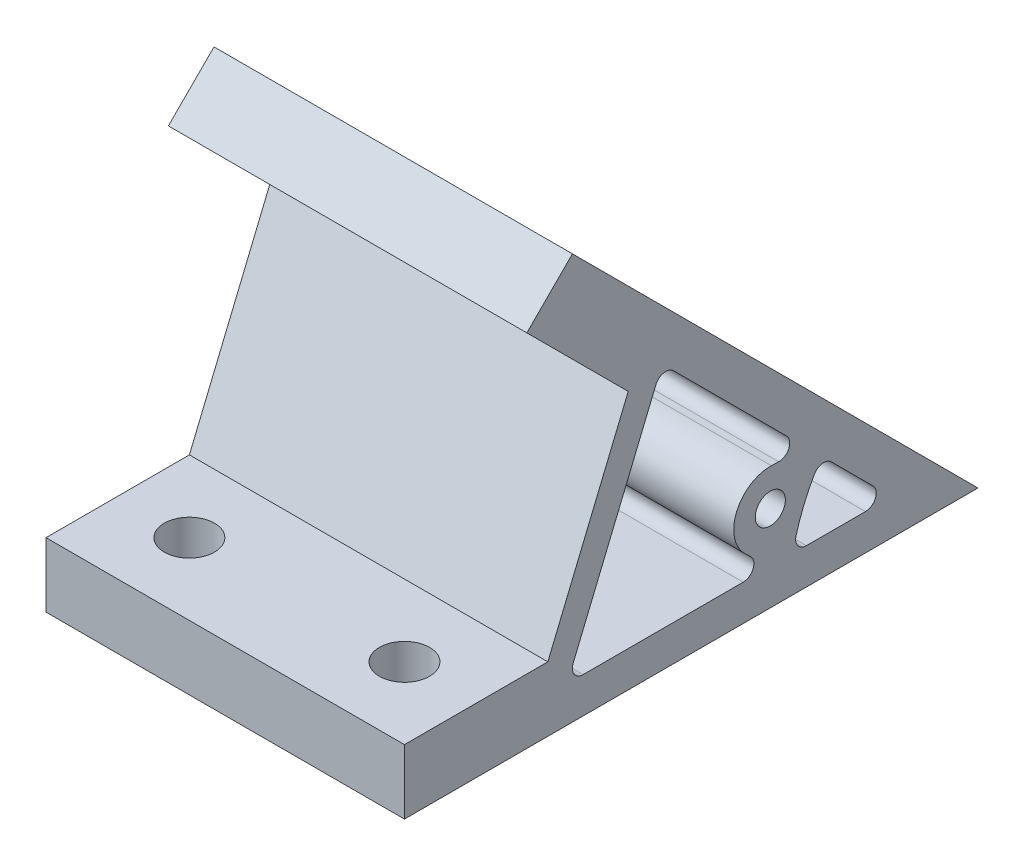
ISO-10303-21;
HEADER;
FILE_DESCRIPTION(('STEP AP214'),'2;1');
FILE_NAME('part.step','',(''),(''),'','','');
FILE_SCHEMA(('AUTOMOTIVE_DESIGN { 1 0 10303 214 1 1 1 1 }'));
ENDSEC;
DATA;
#1=APPLICATION_CONTEXT('core data for automotive mechanical design processes');
#2=APPLICATION_PROTOCOL_DEFINITION('international standard','automotive_design',2000,#1);
#3=PRODUCT_CONTEXT('',#1,'mechanical');
#4=PRODUCT('Part','Part','',(#3));
#5=PRODUCT_RELATED_PRODUCT_CATEGORY('part','',(#4));
#6=PRODUCT_DEFINITION_FORMATION('','',#4);
#7=PRODUCT_DEFINITION_CONTEXT('part definition',#1,'design');
#8=PRODUCT_DEFINITION('design','',#6,#7);
#9=PRODUCT_DEFINITION_SHAPE('','',#8);
#10=(LENGTH_UNIT() NAMED_UNIT(*) SI_UNIT(.MILLI.,.METRE.));
#11=(NAMED_UNIT(*) PLANE_ANGLE_UNIT() SI_UNIT($,.RADIAN.));
#12=(NAMED_UNIT(*) SI_UNIT($,.STERADIAN.) SOLID_ANGLE_UNIT());
#13=UNCERTAINTY_MEASURE_WITH_UNIT(LENGTH_MEASURE(1.E-05),#10,'distance_accuracy_value','');
#14=(GEOMETRIC_REPRESENTATION_CONTEXT(3) GLOBAL_UNCERTAINTY_ASSIGNED_CONTEXT((#13)) GLOBAL_UNIT_ASSIGNED_CONTEXT((#10,
#11,#12)) REPRESENTATION_CONTEXT('',''));
#15=CARTESIAN_POINT('',(0.,0.,0.));
#16=DIRECTION('',(0.,0.,1.));
#17=DIRECTION('',(1.,0.,0.));
#18=AXIS2_PLACEMENT_3D('',#15,#16,#17);
#19=CARTESIAN_POINT('',(25.,0.,80.));
#20=DIRECTION('',(0.,1.,0.));
#21=DIRECTION('',(0.,0.,1.));
#22=AXIS2_PLACEMENT_3D('',#19,#20,#21);
#23=PLANE('',#22);
#24=CARTESIAN_POINT('',(-15.,0.,70.));
#25=DIRECTION('',(0.,1.,0.));
#26=DIRECTION('',(0.,0.,1.));
#27=AXIS2_PLACEMENT_3D('',#24,#25,#26);
#28=CIRCLE('',#27,3.5);
#29=CARTESIAN_POINT('',(-15.,0.,73.5));
#30=VERTEX_POINT('',#29);
#31=EDGE_CURVE('E618',#30,#30,#28,.T.);
#32=ORIENTED_EDGE('',*,*,#31,.T.);
#33=EDGE_LOOP('',(#32));
#34=FACE_BOUND('',#33,.T.);
#35=DIRECTION('',(-1.,0.,0.));
#36=VECTOR('',#35,1.);
#37=CARTESIAN_POINT('',(25.,0.,80.));
#38=LINE('',#37,#36);
#39=CARTESIAN_POINT('',(25.,0.,80.));
#40=VERTEX_POINT('',#39);
#41=CARTESIAN_POINT('',(-25.,0.,80.));
#42=VERTEX_POINT('',#41);
#43=EDGE_CURVE('E11',#40,#42,#38,.T.);
#44=ORIENTED_EDGE('',*,*,#43,.T.);
#45=DIRECTION('',(0.,0.,-1.));
#46=VECTOR('',#45,1.);
#47=CARTESIAN_POINT('',(-25.,0.,80.));
#48=LINE('',#47,#46);
#49=CARTESIAN_POINT('',(-25.,0.,0.));
#50=VERTEX_POINT('',#49);
#51=EDGE_CURVE('E266',#42,#50,#48,.T.);
#52=ORIENTED_EDGE('',*,*,#51,.T.);
#53=DIRECTION('',(-1.,0.,0.));
#54=VECTOR('',#53,1.);
#55=CARTESIAN_POINT('',(25.,0.,0.));
#56=LINE('',#55,#54);
#57=CARTESIAN_POINT('',(25.,0.,0.));
#58=VERTEX_POINT('',#57);
#59=EDGE_CURVE('E43',#58,#50,#56,.T.);
#60=ORIENTED_EDGE('',*,*,#59,.F.);
#61=DIRECTION('',(0.,0.,-1.));
#62=VECTOR('',#61,1.);
#63=CARTESIAN_POINT('',(25.,0.,80.));
#64=LINE('',#63,#62);
#65=EDGE_CURVE('E347',#40,#58,#64,.T.);
#66=ORIENTED_EDGE('',*,*,#65,.F.);
#67=EDGE_LOOP('',(#44,#52,#60,#66));
#68=FACE_BOUND('',#67,.T.);
#69=CARTESIAN_POINT('',(15.,0.,70.));
#70=DIRECTION('',(0.,1.,0.));
#71=DIRECTION('',(0.,0.,1.));
#72=AXIS2_PLACEMENT_3D('',#69,#70,#71);
#73=CIRCLE('',#72,3.5);
#74=CARTESIAN_POINT('',(15.,0.,73.5));
#75=VERTEX_POINT('',#74);
#76=EDGE_CURVE('E616',#75,#75,#73,.T.);
#77=ORIENTED_EDGE('',*,*,#76,.T.);
#78=EDGE_LOOP('',(#77));
#79=FACE_BOUND('',#78,.T.);
#80=ADVANCED_FACE('F35',(#34,#68,#79),#23,.F.);
#81=CARTESIAN_POINT('',(25.,9.,60.));
#82=DIRECTION('',(0.,-1.,0.));
#83=DIRECTION('',(0.,0.,-1.));
#84=AXIS2_PLACEMENT_3D('',#81,#82,#83);
#85=PLANE('',#84);
#86=CARTESIAN_POINT('',(-15.,9.,70.));
#87=DIRECTION('',(0.,1.,0.));
#88=DIRECTION('',(0.,0.,1.));
#89=AXIS2_PLACEMENT_3D('',#86,#87,#88);
#90=CIRCLE('',#89,3.5);
#91=CARTESIAN_POINT('',(-15.,9.,73.5));
#92=VERTEX_POINT('',#91);
#93=EDGE_CURVE('E621',#92,#92,#90,.T.);
#94=ORIENTED_EDGE('',*,*,#93,.F.);
#95=EDGE_LOOP('',(#94));
#96=FACE_BOUND('',#95,.T.);
#97=DIRECTION('',(-1.,0.,0.));
#98=VECTOR('',#97,1.);
#99=CARTESIAN_POINT('',(25.,9.,60.));
#100=LINE('',#99,#98);
#101=CARTESIAN_POINT('',(25.,9.,60.));
#102=VERTEX_POINT('',#101);
#103=CARTESIAN_POINT('',(-25.,9.,60.));
#104=VERTEX_POINT('',#103);
#105=EDGE_CURVE('E361',#102,#104,#100,.T.);
#106=ORIENTED_EDGE('',*,*,#105,.T.);
#107=DIRECTION('',(0.,0.,1.));
#108=VECTOR('',#107,1.);
#109=CARTESIAN_POINT('',(-25.,9.,60.));
#110=LINE('',#109,#108);
#111=CARTESIAN_POINT('',(-25.,9.,80.));
#112=VERTEX_POINT('',#111);
#113=EDGE_CURVE('E281',#104,#112,#110,.T.);
#114=ORIENTED_EDGE('',*,*,#113,.T.);
#115=DIRECTION('',(-1.,0.,0.));
#116=VECTOR('',#115,1.);
#117=CARTESIAN_POINT('',(25.,9.,80.));
#118=LINE('',#117,#116);
#119=CARTESIAN_POINT('',(25.,9.,80.));
#120=VERTEX_POINT('',#119);
#121=EDGE_CURVE('E359',#120,#112,#118,.T.);
#122=ORIENTED_EDGE('',*,*,#121,.F.);
#123=DIRECTION('',(0.,0.,1.));
#124=VECTOR('',#123,1.);
#125=CARTESIAN_POINT('',(25.,9.,60.));
#126=LINE('',#125,#124);
#127=EDGE_CURVE('E357',#102,#120,#126,.T.);
#128=ORIENTED_EDGE('',*,*,#127,.F.);
#129=EDGE_LOOP('',(#106,#114,#122,#128));
#130=FACE_BOUND('',#129,.T.);
#131=CARTESIAN_POINT('',(15.,9.,70.));
#132=DIRECTION('',(0.,1.,0.));
#133=DIRECTION('',(0.,0.,1.));
#134=AXIS2_PLACEMENT_3D('',#131,#132,#133);
#135=CIRCLE('',#134,3.5);
#136=CARTESIAN_POINT('',(15.,9.,73.5));
#137=VERTEX_POINT('',#136);
#138=EDGE_CURVE('E613',#137,#137,#135,.T.);
#139=ORIENTED_EDGE('',*,*,#138,.F.);
#140=EDGE_LOOP('',(#139));
#141=FACE_BOUND('',#140,.T.);
#142=ADVANCED_FACE('F388',(#96,#130,#141),#85,.F.);
#143=CARTESIAN_POINT('',(25.,0.,0.));
#144=DIRECTION('',(1.,0.,0.));
#145=DIRECTION('',(0.,0.,-1.));
#146=AXIS2_PLACEMENT_3D('',#143,#144,#145);
#147=PLANE('',#146);
#148=CARTESIAN_POINT('',(25.,12.,28.970562748477));
#149=DIRECTION('',(1.,0.,0.));
#150=DIRECTION('',(0.,0.,-1.));
#151=AXIS2_PLACEMENT_3D('',#148,#149,#150);
#152=CIRCLE('',#151,2.1);
#153=CARTESIAN_POINT('',(25.,12.,26.870562748477));
#154=VERTEX_POINT('',#153);
#155=EDGE_CURVE('E200',#154,#154,#152,.T.);
#156=ORIENTED_EDGE('',*,*,#155,.F.);
#157=EDGE_LOOP('',(#156));
#158=FACE_BOUND('',#157,.T.);
#159=DIRECTION('',(0.,-1.,0.));
#160=VECTOR('',#159,1.);
#161=CARTESIAN_POINT('',(25.,9.,80.));
#162=LINE('',#161,#160);
#163=EDGE_CURVE('E344',#120,#40,#162,.T.);
#164=ORIENTED_EDGE('',*,*,#163,.T.);
#165=ORIENTED_EDGE('',*,*,#65,.T.);
#166=DIRECTION('',(0.,0.707106781186547,0.707106781186547));
#167=VECTOR('',#166,1.);
#168=CARTESIAN_POINT('',(25.,0.,0.));
#169=LINE('',#168,#167);
#170=CARTESIAN_POINT('',(25.,56.568542494924,56.568542494924));
#171=VERTEX_POINT('',#170);
#172=EDGE_CURVE('E349',#58,#171,#169,.T.);
#173=ORIENTED_EDGE('',*,*,#172,.T.);
#174=DIRECTION('',(0.,-0.707106781186547,0.707106781186548));
#175=VECTOR('',#174,1.);
#176=CARTESIAN_POINT('',(25.,56.568542494924,56.568542494924));
#177=LINE('',#176,#175);
#178=CARTESIAN_POINT('',(25.,50.204581464245,62.932503525603));
#179=VERTEX_POINT('',#178);
#180=EDGE_CURVE('E351',#171,#179,#177,.T.);
#181=ORIENTED_EDGE('',*,*,#180,.T.);
#182=DIRECTION('',(0.,-0.707106781186547,-0.707106781186547));
#183=VECTOR('',#182,1.);
#184=CARTESIAN_POINT('',(25.,50.204581464245,62.932503525603));
#185=LINE('',#184,#183);
#186=CARTESIAN_POINT('',(25.,36.062445840514,48.790367901872));
#187=VERTEX_POINT('',#186);
#188=EDGE_CURVE('E353',#179,#187,#185,.T.);
#189=ORIENTED_EDGE('',*,*,#188,.T.);
#190=DIRECTION('',(0.,-0.92387953251129,0.382683432365082));
#191=VECTOR('',#190,1.);
#192=CARTESIAN_POINT('',(25.,36.062445840514,48.790367901872));
#193=LINE('',#192,#191);
#194=EDGE_CURVE('E355',#187,#102,#193,.T.);
#195=ORIENTED_EDGE('',*,*,#194,.T.);
#196=ORIENTED_EDGE('',*,*,#127,.T.);
#197=EDGE_LOOP('',(#164,#165,#173,#181,#189,#195,#196));
#198=FACE_BOUND('',#197,.T.);
#199=CARTESIAN_POINT('',(25.,6.49999999999955,23.9330315672719));
#200=DIRECTION('',(1.,0.,0.));
#201=DIRECTION('',(0.,0.,-1.));
#202=AXIS2_PLACEMENT_3D('',#199,#200,#201);
#203=CIRCLE('',#202,1.49999999999955);
#204=CARTESIAN_POINT('',(25.,6.8931451612903,25.380593960453));
#205=VERTEX_POINT('',#204);
#206=CARTESIAN_POINT('',(25.,5.,23.933031567271));
#207=VERTEX_POINT('',#206);
#208=EDGE_CURVE('E323',#205,#207,#203,.T.);
#209=ORIENTED_EDGE('',*,*,#208,.F.);
#210=CARTESIAN_POINT('',(25.,0.,0.));
#211=DIRECTION('',(1.,0.,0.));
#212=DIRECTION('',(0.,0.,-1.));
#213=AXIS2_PLACEMENT_3D('',#210,#211,#212);
#214=CIRCLE('',#213,26.2999999999999);
#215=CARTESIAN_POINT('',(25.,13.072600328931,22.820979835231));
#216=VERTEX_POINT('',#215);
#217=EDGE_CURVE('E321',#216,#205,#214,.T.);
#218=ORIENTED_EDGE('',*,*,#217,.F.);
#219=CARTESIAN_POINT('',(25.,12.3270148378583,21.519402993282));
#220=DIRECTION('',(1.,0.,0.));
#221=DIRECTION('',(0.,0.,-1.));
#222=AXIS2_PLACEMENT_3D('',#219,#220,#221);
#223=CIRCLE('',#222,1.49999999999864);
#224=CARTESIAN_POINT('',(25.,13.387675009636,20.458742821502));
#225=VERTEX_POINT('',#224);
#226=EDGE_CURVE('E331',#225,#216,#223,.T.);
#227=ORIENTED_EDGE('',*,*,#226,.F.);
#228=DIRECTION('',(0.,0.707106781186499,0.707106781186596));
#229=VECTOR('',#228,1.);
#230=CARTESIAN_POINT('',(25.,7.5606601717798,14.631727983645));
#231=LINE('',#230,#229);
#232=CARTESIAN_POINT('',(25.,7.5606601717798,14.631727983645));
#233=VERTEX_POINT('',#232);
#234=EDGE_CURVE('E329',#233,#225,#231,.T.);
#235=ORIENTED_EDGE('',*,*,#234,.F.);
#236=CARTESIAN_POINT('',(25.,6.50000000000006,15.692388155425));
#237=DIRECTION('',(1.,0.,0.));
#238=DIRECTION('',(0.,0.,-1.));
#239=AXIS2_PLACEMENT_3D('',#236,#237,#238);
#240=CIRCLE('',#239,1.50000000000006);
#241=CARTESIAN_POINT('',(25.,5.,15.692388155425));
#242=VERTEX_POINT('',#241);
#243=EDGE_CURVE('E327',#242,#233,#240,.T.);
#244=ORIENTED_EDGE('',*,*,#243,.F.);
#245=DIRECTION('',(0.,0.,-1.));
#246=VECTOR('',#245,1.);
#247=CARTESIAN_POINT('',(25.,5.,23.933031567271));
#248=LINE('',#247,#246);
#249=EDGE_CURVE('E325',#207,#242,#248,.T.);
#250=ORIENTED_EDGE('',*,*,#249,.F.);
#251=EDGE_LOOP('',(#209,#218,#227,#235,#244,#250));
#252=FACE_BOUND('',#251,.T.);
#253=DIRECTION('',(0.,0.,-1.));
#254=VECTOR('',#253,1.);
#255=CARTESIAN_POINT('',(25.,5.,55.082376804325));
#256=LINE('',#255,#254);
#257=CARTESIAN_POINT('',(25.,5.,55.082376804325));
#258=VERTEX_POINT('',#257);
#259=CARTESIAN_POINT('',(25.,5.,32.755922357341));
#260=VERTEX_POINT('',#259);
#261=EDGE_CURVE('E285',#258,#260,#256,.T.);
#262=ORIENTED_EDGE('',*,*,#261,.F.);
#263=CARTESIAN_POINT('',(25.,6.49999999999987,55.0823768043242));
#264=DIRECTION('',(1.,0.,0.));
#265=DIRECTION('',(0.,0.,-1.));
#266=AXIS2_PLACEMENT_3D('',#263,#264,#265);
#267=CIRCLE('',#266,1.49999999999987);
#268=CARTESIAN_POINT('',(25.,7.0740251485476,56.468196103091));
#269=VERTEX_POINT('',#268);
#270=EDGE_CURVE('E197',#269,#258,#267,.T.);
#271=ORIENTED_EDGE('',*,*,#270,.F.);
#272=DIRECTION('',(0.,-0.923879532511295,0.38268343236507));
#273=VECTOR('',#272,1.);
#274=CARTESIAN_POINT('',(25.,34.926953233046,44.93113553869));
#275=LINE('',#274,#273);
#276=CARTESIAN_POINT('',(25.,34.926953233046,44.93113553869));
#277=VERTEX_POINT('',#276);
#278=EDGE_CURVE('E301',#277,#269,#275,.T.);
#279=ORIENTED_EDGE('',*,*,#278,.F.);
#280=CARTESIAN_POINT('',(25.,34.3529280844978,43.5453162399229));
#281=DIRECTION('',(1.,0.,0.));
#282=DIRECTION('',(0.,0.,-1.));
#283=AXIS2_PLACEMENT_3D('',#280,#281,#282);
#284=CIRCLE('',#283,1.50000000000037);
#285=CARTESIAN_POINT('',(25.,35.413588256278,42.484656068143));
#286=VERTEX_POINT('',#285);
#287=EDGE_CURVE('E299',#286,#277,#284,.T.);
#288=ORIENTED_EDGE('',*,*,#287,.F.);
#289=DIRECTION('',(0.,0.70710678118657,0.707106781186525));
#290=VECTOR('',#289,1.);
#291=CARTESIAN_POINT('',(25.,19.626400916963,26.697468728829));
#292=LINE('',#291,#290);
#293=CARTESIAN_POINT('',(25.,19.626400916963,26.697468728829));
#294=VERTEX_POINT('',#293);
#295=EDGE_CURVE('E297',#294,#286,#292,.T.);
#296=ORIENTED_EDGE('',*,*,#295,.F.);
#297=CARTESIAN_POINT('',(25.,18.5657407451835,27.7581289006084));
#298=DIRECTION('',(1.,0.,0.));
#299=DIRECTION('',(0.,0.,-1.));
#300=AXIS2_PLACEMENT_3D('',#297,#298,#299);
#301=CIRCLE('',#300,1.49999999999954);
#302=CARTESIAN_POINT('',(25.,17.066453826823,27.804375375413));
#303=VERTEX_POINT('',#302);
#304=EDGE_CURVE('E295',#303,#294,#301,.T.);
#305=ORIENTED_EDGE('',*,*,#304,.F.);
#306=DIRECTION('',(0.,-0.0308309832021536,-0.999524612240633));
#307=VECTOR('',#306,1.);
#308=CARTESIAN_POINT('',(25.,17.097575522427,28.813324734144));
#309=LINE('',#308,#307);
#310=CARTESIAN_POINT('',(25.,17.097575522427,28.813324734144));
#311=VERTEX_POINT('',#310);
#312=EDGE_CURVE('E293',#311,#303,#309,.T.);
#313=ORIENTED_EDGE('',*,*,#312,.F.);
#314=CARTESIAN_POINT('',(25.,12.,28.970562748477));
#315=DIRECTION('',(-1.,0.,0.));
#316=DIRECTION('',(0.,0.,1.));
#317=AXIS2_PLACEMENT_3D('',#314,#315,#316);
#318=CIRCLE('',#317,5.09999999999982);
#319=CARTESIAN_POINT('',(25.,8.28428571428569,32.4639089018));
#320=VERTEX_POINT('',#319);
#321=EDGE_CURVE('E291',#320,#311,#318,.T.);
#322=ORIENTED_EDGE('',*,*,#321,.F.);
#323=DIRECTION('',(0.,0.684969833985216,0.72857142857119));
#324=VECTOR('',#323,1.);
#325=CARTESIAN_POINT('',(25.,7.5928571428571,31.728467606364));
#326=LINE('',#325,#324);
#327=CARTESIAN_POINT('',(25.,7.5928571428571,31.728467606364));
#328=VERTEX_POINT('',#327);
#329=EDGE_CURVE('E289',#328,#320,#326,.T.);
#330=ORIENTED_EDGE('',*,*,#329,.F.);
#331=CARTESIAN_POINT('',(25.,6.49999999999976,32.7559223573409));
#332=DIRECTION('',(1.,0.,0.));
#333=DIRECTION('',(0.,0.,-1.));
#334=AXIS2_PLACEMENT_3D('',#331,#332,#333);
#335=CIRCLE('',#334,1.49999999999976);
#336=EDGE_CURVE('E287',#260,#328,#335,.T.);
#337=ORIENTED_EDGE('',*,*,#336,.F.);
#338=EDGE_LOOP('',(#262,#271,#279,#288,#296,#305,#313,#322,#330,#337));
#339=FACE_BOUND('',#338,.T.);
#340=ADVANCED_FACE('F404',(#158,#198,#252,#339),#147,.T.);
#341=CARTESIAN_POINT('',(25.,9.,80.));
#342=DIRECTION('',(0.,0.,-1.));
#343=DIRECTION('',(-1.,0.,0.));
#344=AXIS2_PLACEMENT_3D('',#341,#342,#343);
#345=PLANE('',#344);
#346=ORIENTED_EDGE('',*,*,#121,.T.);
#347=DIRECTION('',(0.,-1.,0.));
#348=VECTOR('',#347,1.);
#349=CARTESIAN_POINT('',(-25.,9.,80.));
#350=LINE('',#349,#348);
#351=EDGE_CURVE('E263',#112,#42,#350,.T.);
#352=ORIENTED_EDGE('',*,*,#351,.T.);
#353=ORIENTED_EDGE('',*,*,#43,.F.);
#354=ORIENTED_EDGE('',*,*,#163,.F.);
#355=EDGE_LOOP('',(#346,#352,#353,#354));
#356=FACE_BOUND('',#355,.T.);
#357=ADVANCED_FACE('F37',(#356),#345,.F.);
#358=CARTESIAN_POINT('',(25.,0.,0.));
#359=DIRECTION('',(0.,-0.707106781186547,0.707106781186547));
#360=DIRECTION('',(0.,-0.707106781186548,-0.707106781186548));
#361=AXIS2_PLACEMENT_3D('',#358,#359,#360);
#362=PLANE('',#361);
#363=CARTESIAN_POINT('',(15.,49.4974746830584,49.4974746830586));
#364=DIRECTION('',(0.,-0.707106781186547,0.707106781186548));
#365=DIRECTION('',(0.,-0.707106781186548,-0.707106781186547));
#366=AXIS2_PLACEMENT_3D('',#363,#364,#365);
#367=CIRCLE('',#366,3.5);
#368=CARTESIAN_POINT('',(15.,47.0226009489055,47.0226009489057));
#369=VERTEX_POINT('',#368);
#370=EDGE_CURVE('E626',#369,#369,#367,.T.);
#371=ORIENTED_EDGE('',*,*,#370,.T.);
#372=EDGE_LOOP('',(#371));
#373=FACE_BOUND('',#372,.T.);
#374=CARTESIAN_POINT('',(-15.,49.4974746830584,49.4974746830586));
#375=DIRECTION('',(0.,-0.707106781186547,0.707106781186548));
#376=DIRECTION('',(0.,-0.707106781186548,-0.707106781186547));
#377=AXIS2_PLACEMENT_3D('',#374,#375,#376);
#378=CIRCLE('',#377,3.5);
#379=CARTESIAN_POINT('',(-15.,47.0226009489055,47.0226009489057));
#380=VERTEX_POINT('',#379);
#381=EDGE_CURVE('E216',#380,#380,#378,.T.);
#382=ORIENTED_EDGE('',*,*,#381,.T.);
#383=EDGE_LOOP('',(#382));
#384=FACE_BOUND('',#383,.T.);
#385=ORIENTED_EDGE('',*,*,#59,.T.);
#386=DIRECTION('',(0.,0.707106781186547,0.707106781186547));
#387=VECTOR('',#386,1.);
#388=CARTESIAN_POINT('',(-25.,0.,0.));
#389=LINE('',#388,#387);
#390=CARTESIAN_POINT('',(-25.,56.568542494924,56.568542494924));
#391=VERTEX_POINT('',#390);
#392=EDGE_CURVE('E269',#50,#391,#389,.T.);
#393=ORIENTED_EDGE('',*,*,#392,.T.);
#394=DIRECTION('',(-1.,0.,0.));
#395=VECTOR('',#394,1.);
#396=CARTESIAN_POINT('',(25.,56.568542494924,56.568542494924));
#397=LINE('',#396,#395);
#398=EDGE_CURVE('E367',#171,#391,#397,.T.);
#399=ORIENTED_EDGE('',*,*,#398,.F.);
#400=ORIENTED_EDGE('',*,*,#172,.F.);
#401=EDGE_LOOP('',(#385,#393,#399,#400));
#402=FACE_BOUND('',#401,.T.);
#403=ADVANCED_FACE('F372',(#373,#384,#402),#362,.F.);
#404=CARTESIAN_POINT('',(25.,56.568542494924,56.568542494924));
#405=DIRECTION('',(0.,-0.707106781186548,-0.707106781186547));
#406=DIRECTION('',(0.,0.707106781186547,-0.707106781186548));
#407=AXIS2_PLACEMENT_3D('',#404,#405,#406);
#408=PLANE('',#407);
#409=ORIENTED_EDGE('',*,*,#398,.T.);
#410=DIRECTION('',(0.,-0.707106781186547,0.707106781186548));
#411=VECTOR('',#410,1.);
#412=CARTESIAN_POINT('',(-25.,56.568542494924,56.568542494924));
#413=LINE('',#412,#411);
#414=CARTESIAN_POINT('',(-25.,50.204581464245,62.932503525603));
#415=VERTEX_POINT('',#414);
#416=EDGE_CURVE('E272',#391,#415,#413,.T.);
#417=ORIENTED_EDGE('',*,*,#416,.T.);
#418=DIRECTION('',(-1.,0.,0.));
#419=VECTOR('',#418,1.);
#420=CARTESIAN_POINT('',(25.,50.204581464245,62.932503525603));
#421=LINE('',#420,#419);
#422=EDGE_CURVE('E365',#179,#415,#421,.T.);
#423=ORIENTED_EDGE('',*,*,#422,.F.);
#424=ORIENTED_EDGE('',*,*,#180,.F.);
#425=EDGE_LOOP('',(#409,#417,#423,#424));
#426=FACE_BOUND('',#425,.T.);
#427=ADVANCED_FACE('F402',(#426),#408,.F.);
#428=CARTESIAN_POINT('',(25.,50.204581464245,62.932503525603));
#429=DIRECTION('',(0.,0.707106781186547,-0.707106781186547));
#430=DIRECTION('',(0.,0.707106781186548,0.707106781186548));
#431=AXIS2_PLACEMENT_3D('',#428,#429,#430);
#432=PLANE('',#431);
#433=CARTESIAN_POINT('',(15.,43.1335136523795,55.8614357137375));
#434=DIRECTION('',(0.,-0.707106781186547,0.707106781186548));
#435=DIRECTION('',(0.,-0.707106781186548,-0.707106781186547));
#436=AXIS2_PLACEMENT_3D('',#433,#434,#435);
#437=CIRCLE('',#436,3.5);
#438=CARTESIAN_POINT('',(15.,40.6586399182266,53.3865619795846));
#439=VERTEX_POINT('',#438);
#440=EDGE_CURVE('E624',#439,#439,#437,.T.);
#441=ORIENTED_EDGE('',*,*,#440,.F.);
#442=EDGE_LOOP('',(#441));
#443=FACE_BOUND('',#442,.T.);
#444=CARTESIAN_POINT('',(-15.,43.1335136523795,55.8614357137375));
#445=DIRECTION('',(0.,-0.707106781186547,0.707106781186548));
#446=DIRECTION('',(0.,-0.707106781186548,-0.707106781186547));
#447=AXIS2_PLACEMENT_3D('',#444,#445,#446);
#448=CIRCLE('',#447,3.5);
#449=CARTESIAN_POINT('',(-15.,40.6586399182266,53.3865619795846));
#450=VERTEX_POINT('',#449);
#451=EDGE_CURVE('E219',#450,#450,#448,.T.);
#452=ORIENTED_EDGE('',*,*,#451,.F.);
#453=EDGE_LOOP('',(#452));
#454=FACE_BOUND('',#453,.T.);
#455=ORIENTED_EDGE('',*,*,#422,.T.);
#456=DIRECTION('',(0.,-0.707106781186547,-0.707106781186547));
#457=VECTOR('',#456,1.);
#458=CARTESIAN_POINT('',(-25.,50.204581464245,62.932503525603));
#459=LINE('',#458,#457);
#460=CARTESIAN_POINT('',(-25.,36.062445840514,48.790367901872));
#461=VERTEX_POINT('',#460);
#462=EDGE_CURVE('E275',#415,#461,#459,.T.);
#463=ORIENTED_EDGE('',*,*,#462,.T.);
#464=DIRECTION('',(-1.,0.,0.));
#465=VECTOR('',#464,1.);
#466=CARTESIAN_POINT('',(25.,36.062445840514,48.790367901872));
#467=LINE('',#466,#465);
#468=EDGE_CURVE('E363',#187,#461,#467,.T.);
#469=ORIENTED_EDGE('',*,*,#468,.F.);
#470=ORIENTED_EDGE('',*,*,#188,.F.);
#471=EDGE_LOOP('',(#455,#463,#469,#470));
#472=FACE_BOUND('',#471,.T.);
#473=ADVANCED_FACE('F397',(#443,#454,#472),#432,.F.);
#474=CARTESIAN_POINT('',(25.,36.062445840514,48.790367901872));
#475=DIRECTION('',(0.,-0.382683432365082,-0.92387953251129));
#476=DIRECTION('',(0.,0.92387953251129,-0.382683432365082));
#477=AXIS2_PLACEMENT_3D('',#474,#475,#476);
#478=PLANE('',#477);
#479=ORIENTED_EDGE('',*,*,#468,.T.);
#480=DIRECTION('',(0.,-0.92387953251129,0.382683432365082));
#481=VECTOR('',#480,1.);
#482=CARTESIAN_POINT('',(-25.,36.062445840514,48.790367901872));
#483=LINE('',#482,#481);
#484=EDGE_CURVE('E278',#461,#104,#483,.T.);
#485=ORIENTED_EDGE('',*,*,#484,.T.);
#486=ORIENTED_EDGE('',*,*,#105,.F.);
#487=ORIENTED_EDGE('',*,*,#194,.F.);
#488=EDGE_LOOP('',(#479,#485,#486,#487));
#489=FACE_BOUND('',#488,.T.);
#490=ADVANCED_FACE('F394',(#489),#478,.F.);
#491=CARTESIAN_POINT('',(25.,0.,0.));
#492=DIRECTION('',(-1.,0.,0.));
#493=DIRECTION('',(0.,0.,1.));
#494=AXIS2_PLACEMENT_3D('',#491,#492,#493);
#495=CYLINDRICAL_SURFACE('',#494,26.2999999999999);
#496=DIRECTION('',(-1.,0.,0.));
#497=VECTOR('',#496,1.);
#498=CARTESIAN_POINT('',(25.,6.8931451612903,25.380593960453));
#499=LINE('',#498,#497);
#500=CARTESIAN_POINT('',(-25.,6.8931451612903,25.380593960453));
#501=VERTEX_POINT('',#500);
#502=EDGE_CURVE('E342',#205,#501,#499,.T.);
#503=ORIENTED_EDGE('',*,*,#502,.T.);
#504=CARTESIAN_POINT('',(-25.,0.,0.));
#505=DIRECTION('',(1.,0.,0.));
#506=DIRECTION('',(0.,0.,-1.));
#507=AXIS2_PLACEMENT_3D('',#504,#505,#506);
#508=CIRCLE('',#507,26.2999999999999);
#509=CARTESIAN_POINT('',(-25.,13.072600328931,22.820979835231));
#510=VERTEX_POINT('',#509);
#511=EDGE_CURVE('E245',#510,#501,#508,.T.);
#512=ORIENTED_EDGE('',*,*,#511,.F.);
#513=DIRECTION('',(-1.,0.,0.));
#514=VECTOR('',#513,1.);
#515=CARTESIAN_POINT('',(25.,13.072600328931,22.820979835231));
#516=LINE('',#515,#514);
#517=EDGE_CURVE('E333',#216,#510,#516,.T.);
#518=ORIENTED_EDGE('',*,*,#517,.F.);
#519=ORIENTED_EDGE('',*,*,#217,.T.);
#520=EDGE_LOOP('',(#503,#512,#518,#519));
#521=FACE_BOUND('',#520,.T.);
#522=ADVANCED_FACE('F475',(#521),#495,.F.);
#523=CARTESIAN_POINT('',(25.,6.49999999999955,23.9330315672719));
#524=DIRECTION('',(-1.,0.,0.));
#525=DIRECTION('',(0.,0.,1.));
#526=AXIS2_PLACEMENT_3D('',#523,#524,#525);
#527=CYLINDRICAL_SURFACE('',#526,1.49999999999955);
#528=DIRECTION('',(-1.,0.,0.));
#529=VECTOR('',#528,1.);
#530=CARTESIAN_POINT('',(25.,5.,23.933031567271));
#531=LINE('',#530,#529);
#532=CARTESIAN_POINT('',(-25.,5.,23.933031567271));
#533=VERTEX_POINT('',#532);
#534=EDGE_CURVE('E340',#207,#533,#531,.T.);
#535=ORIENTED_EDGE('',*,*,#534,.T.);
#536=CARTESIAN_POINT('',(-25.,6.49999999999955,23.9330315672719));
#537=DIRECTION('',(1.,0.,0.));
#538=DIRECTION('',(0.,0.,-1.));
#539=AXIS2_PLACEMENT_3D('',#536,#537,#538);
#540=CIRCLE('',#539,1.49999999999955);
#541=EDGE_CURVE('E248',#501,#533,#540,.T.);
#542=ORIENTED_EDGE('',*,*,#541,.F.);
#543=ORIENTED_EDGE('',*,*,#502,.F.);
#544=ORIENTED_EDGE('',*,*,#208,.T.);
#545=EDGE_LOOP('',(#535,#542,#543,#544));
#546=FACE_BOUND('',#545,.T.);
#547=ADVANCED_FACE('F479',(#546),#527,.F.);
#548=CARTESIAN_POINT('',(25.,5.,23.933031567271));
#549=DIRECTION('',(0.,1.,0.));
#550=DIRECTION('',(0.,0.,1.));
#551=AXIS2_PLACEMENT_3D('',#548,#549,#550);
#552=PLANE('',#551);
#553=DIRECTION('',(-1.,0.,0.));
#554=VECTOR('',#553,1.);
#555=CARTESIAN_POINT('',(25.,5.,15.692388155425));
#556=LINE('',#555,#554);
#557=CARTESIAN_POINT('',(-25.,5.,15.692388155425));
#558=VERTEX_POINT('',#557);
#559=EDGE_CURVE('E338',#242,#558,#556,.T.);
#560=ORIENTED_EDGE('',*,*,#559,.T.);
#561=DIRECTION('',(0.,0.,-1.));
#562=VECTOR('',#561,1.);
#563=CARTESIAN_POINT('',(-25.,5.,23.933031567271));
#564=LINE('',#563,#562);
#565=EDGE_CURVE('E251',#533,#558,#564,.T.);
#566=ORIENTED_EDGE('',*,*,#565,.F.);
#567=ORIENTED_EDGE('',*,*,#534,.F.);
#568=ORIENTED_EDGE('',*,*,#249,.T.);
#569=EDGE_LOOP('',(#560,#566,#567,#568));
#570=FACE_BOUND('',#569,.T.);
#571=ADVANCED_FACE('F483',(#570),#552,.T.);
#572=CARTESIAN_POINT('',(25.,6.50000000000006,15.692388155425));
#573=DIRECTION('',(-1.,0.,0.));
#574=DIRECTION('',(0.,0.,1.));
#575=AXIS2_PLACEMENT_3D('',#572,#573,#574);
#576=CYLINDRICAL_SURFACE('',#575,1.50000000000006);
#577=DIRECTION('',(-1.,0.,0.));
#578=VECTOR('',#577,1.);
#579=CARTESIAN_POINT('',(25.,7.5606601717798,14.631727983645));
#580=LINE('',#579,#578);
#581=CARTESIAN_POINT('',(-25.,7.5606601717798,14.631727983645));
#582=VERTEX_POINT('',#581);
#583=EDGE_CURVE('E336',#233,#582,#580,.T.);
#584=ORIENTED_EDGE('',*,*,#583,.T.);
#585=CARTESIAN_POINT('',(-25.,6.50000000000006,15.692388155425));
#586=DIRECTION('',(1.,0.,0.));
#587=DIRECTION('',(0.,0.,-1.));
#588=AXIS2_PLACEMENT_3D('',#585,#586,#587);
#589=CIRCLE('',#588,1.50000000000006);
#590=EDGE_CURVE('E254',#558,#582,#589,.T.);
#591=ORIENTED_EDGE('',*,*,#590,.F.);
#592=ORIENTED_EDGE('',*,*,#559,.F.);
#593=ORIENTED_EDGE('',*,*,#243,.T.);
#594=EDGE_LOOP('',(#584,#591,#592,#593));
#595=FACE_BOUND('',#594,.T.);
#596=ADVANCED_FACE('F487',(#595),#576,.F.);
#597=CARTESIAN_POINT('',(25.,7.5606601717798,14.631727983645));
#598=DIRECTION('',(0.,-0.707106781186596,0.707106781186499));
#599=DIRECTION('',(0.,-0.707106781186499,-0.707106781186596));
#600=AXIS2_PLACEMENT_3D('',#597,#598,#599);
#601=PLANE('',#600);
#602=DIRECTION('',(-1.,0.,0.));
#603=VECTOR('',#602,1.);
#604=CARTESIAN_POINT('',(25.,13.387675009636,20.458742821502));
#605=LINE('',#604,#603);
#606=CARTESIAN_POINT('',(-25.,13.387675009636,20.458742821502));
#607=VERTEX_POINT('',#606);
#608=EDGE_CURVE('E58',#225,#607,#605,.T.);
#609=ORIENTED_EDGE('',*,*,#608,.T.);
#610=DIRECTION('',(0.,0.707106781186499,0.707106781186596));
#611=VECTOR('',#610,1.);
#612=CARTESIAN_POINT('',(-25.,7.5606601717798,14.631727983645));
#613=LINE('',#612,#611);
#614=EDGE_CURVE('E257',#582,#607,#613,.T.);
#615=ORIENTED_EDGE('',*,*,#614,.F.);
#616=ORIENTED_EDGE('',*,*,#583,.F.);
#617=ORIENTED_EDGE('',*,*,#234,.T.);
#618=EDGE_LOOP('',(#609,#615,#616,#617));
#619=FACE_BOUND('',#618,.T.);
#620=ADVANCED_FACE('F491',(#619),#601,.T.);
#621=CARTESIAN_POINT('',(25.,12.3270148378583,21.519402993282));
#622=DIRECTION('',(-1.,0.,0.));
#623=DIRECTION('',(0.,0.,1.));
#624=AXIS2_PLACEMENT_3D('',#621,#622,#623);
#625=CYLINDRICAL_SURFACE('',#624,1.49999999999864);
#626=ORIENTED_EDGE('',*,*,#517,.T.);
#627=CARTESIAN_POINT('',(-25.,12.3270148378583,21.519402993282));
#628=DIRECTION('',(1.,0.,0.));
#629=DIRECTION('',(0.,0.,-1.));
#630=AXIS2_PLACEMENT_3D('',#627,#628,#629);
#631=CIRCLE('',#630,1.49999999999864);
#632=EDGE_CURVE('E260',#607,#510,#631,.T.);
#633=ORIENTED_EDGE('',*,*,#632,.F.);
#634=ORIENTED_EDGE('',*,*,#608,.F.);
#635=ORIENTED_EDGE('',*,*,#226,.T.);
#636=EDGE_LOOP('',(#626,#633,#634,#635));
#637=FACE_BOUND('',#636,.T.);
#638=ADVANCED_FACE('F495',(#637),#625,.F.);
#639=CARTESIAN_POINT('',(25.,12.,28.970562748477));
#640=DIRECTION('',(-1.,0.,0.));
#641=DIRECTION('',(0.,0.,1.));
#642=AXIS2_PLACEMENT_3D('',#639,#640,#641);
#643=CYLINDRICAL_SURFACE('',#642,2.1);
#644=ORIENTED_EDGE('',*,*,#155,.T.);
#645=EDGE_LOOP('',(#644));
#646=FACE_BOUND('',#645,.T.);
#647=CARTESIAN_POINT('',(-25.,12.,28.970562748477));
#648=DIRECTION('',(1.,0.,0.));
#649=DIRECTION('',(0.,0.,-1.));
#650=AXIS2_PLACEMENT_3D('',#647,#648,#649);
#651=CIRCLE('',#650,2.1);
#652=CARTESIAN_POINT('',(-25.,12.,26.870562748477));
#653=VERTEX_POINT('',#652);
#654=EDGE_CURVE('E242',#653,#653,#651,.T.);
#655=ORIENTED_EDGE('',*,*,#654,.F.);
#656=EDGE_LOOP('',(#655));
#657=FACE_BOUND('',#656,.T.);
#658=ADVANCED_FACE('F499',(#646,#657),#643,.F.);
#659=CARTESIAN_POINT('',(25.,6.49999999999987,55.0823768043242));
#660=DIRECTION('',(-1.,0.,0.));
#661=DIRECTION('',(0.,0.,1.));
#662=AXIS2_PLACEMENT_3D('',#659,#660,#661);
#663=CYLINDRICAL_SURFACE('',#662,1.49999999999987);
#664=DIRECTION('',(-1.,0.,0.));
#665=VECTOR('',#664,1.);
#666=CARTESIAN_POINT('',(25.,5.,55.082376804325));
#667=LINE('',#666,#665);
#668=CARTESIAN_POINT('',(-25.,5.,55.082376804325));
#669=VERTEX_POINT('',#668);
#670=EDGE_CURVE('E189',#258,#669,#667,.T.);
#671=ORIENTED_EDGE('',*,*,#670,.T.);
#672=CARTESIAN_POINT('',(-25.,6.49999999999987,55.0823768043242));
#673=DIRECTION('',(1.,0.,0.));
#674=DIRECTION('',(0.,0.,-1.));
#675=AXIS2_PLACEMENT_3D('',#672,#673,#674);
#676=CIRCLE('',#675,1.49999999999987);
#677=CARTESIAN_POINT('',(-25.,7.0740251485476,56.468196103091));
#678=VERTEX_POINT('',#677);
#679=EDGE_CURVE('E194',#678,#669,#676,.T.);
#680=ORIENTED_EDGE('',*,*,#679,.F.);
#681=DIRECTION('',(-1.,0.,0.));
#682=VECTOR('',#681,1.);
#683=CARTESIAN_POINT('',(25.,7.0740251485476,56.468196103091));
#684=LINE('',#683,#682);
#685=EDGE_CURVE('E303',#269,#678,#684,.T.);
#686=ORIENTED_EDGE('',*,*,#685,.F.);
#687=ORIENTED_EDGE('',*,*,#270,.T.);
#688=EDGE_LOOP('',(#671,#680,#686,#687));
#689=FACE_BOUND('',#688,.T.);
#690=ADVANCED_FACE('F191',(#689),#663,.F.);
#691=CARTESIAN_POINT('',(25.,5.,55.082376804325));
#692=DIRECTION('',(0.,1.,0.));
#693=DIRECTION('',(0.,0.,1.));
#694=AXIS2_PLACEMENT_3D('',#691,#692,#693);
#695=PLANE('',#694);
#696=DIRECTION('',(-1.,0.,0.));
#697=VECTOR('',#696,1.);
#698=CARTESIAN_POINT('',(25.,5.,32.755922357341));
#699=LINE('',#698,#697);
#700=CARTESIAN_POINT('',(-25.,5.,32.755922357341));
#701=VERTEX_POINT('',#700);
#702=EDGE_CURVE('E201',#260,#701,#699,.T.);
#703=ORIENTED_EDGE('',*,*,#702,.T.);
#704=DIRECTION('',(0.,0.,-1.));
#705=VECTOR('',#704,1.);
#706=CARTESIAN_POINT('',(-25.,5.,55.082376804325));
#707=LINE('',#706,#705);
#708=EDGE_CURVE('E204',#669,#701,#707,.T.);
#709=ORIENTED_EDGE('',*,*,#708,.F.);
#710=ORIENTED_EDGE('',*,*,#670,.F.);
#711=ORIENTED_EDGE('',*,*,#261,.T.);
#712=EDGE_LOOP('',(#703,#709,#710,#711));
#713=FACE_BOUND('',#712,.T.);
#714=ADVANCED_FACE('F205',(#713),#695,.T.);
#715=CARTESIAN_POINT('',(25.,6.49999999999976,32.7559223573409));
#716=DIRECTION('',(-1.,0.,0.));
#717=DIRECTION('',(0.,0.,1.));
#718=AXIS2_PLACEMENT_3D('',#715,#716,#717);
#719=CYLINDRICAL_SURFACE('',#718,1.49999999999976);
#720=DIRECTION('',(-1.,0.,0.));
#721=VECTOR('',#720,1.);
#722=CARTESIAN_POINT('',(25.,7.5928571428571,31.728467606364));
#723=LINE('',#722,#721);
#724=CARTESIAN_POINT('',(-25.,7.5928571428571,31.728467606364));
#725=VERTEX_POINT('',#724);
#726=EDGE_CURVE('E316',#328,#725,#723,.T.);
#727=ORIENTED_EDGE('',*,*,#726,.T.);
#728=CARTESIAN_POINT('',(-25.,6.49999999999976,32.7559223573409));
#729=DIRECTION('',(1.,0.,0.));
#730=DIRECTION('',(0.,0.,-1.));
#731=AXIS2_PLACEMENT_3D('',#728,#729,#730);
#732=CIRCLE('',#731,1.49999999999976);
#733=EDGE_CURVE('E210',#701,#725,#732,.T.);
#734=ORIENTED_EDGE('',*,*,#733,.F.);
#735=ORIENTED_EDGE('',*,*,#702,.F.);
#736=ORIENTED_EDGE('',*,*,#336,.T.);
#737=EDGE_LOOP('',(#727,#734,#735,#736));
#738=FACE_BOUND('',#737,.T.);
#739=ADVANCED_FACE('F417',(#738),#719,.F.);
#740=CARTESIAN_POINT('',(25.,7.5928571428571,31.728467606364));
#741=DIRECTION('',(0.,-0.72857142857119,0.684969833985216));
#742=DIRECTION('',(0.,-0.684969833985216,-0.728571428571191));
#743=AXIS2_PLACEMENT_3D('',#740,#741,#742);
#744=PLANE('',#743);
#745=DIRECTION('',(-1.,0.,0.));
#746=VECTOR('',#745,1.);
#747=CARTESIAN_POINT('',(25.,8.28428571428569,32.4639089018));
#748=LINE('',#747,#746);
#749=CARTESIAN_POINT('',(-25.,8.28428571428569,32.4639089018));
#750=VERTEX_POINT('',#749);
#751=EDGE_CURVE('E314',#320,#750,#748,.T.);
#752=ORIENTED_EDGE('',*,*,#751,.T.);
#753=DIRECTION('',(0.,0.684969833985216,0.72857142857119));
#754=VECTOR('',#753,1.);
#755=CARTESIAN_POINT('',(-25.,7.5928571428571,31.728467606364));
#756=LINE('',#755,#754);
#757=EDGE_CURVE('E224',#725,#750,#756,.T.);
#758=ORIENTED_EDGE('',*,*,#757,.F.);
#759=ORIENTED_EDGE('',*,*,#726,.F.);
#760=ORIENTED_EDGE('',*,*,#329,.T.);
#761=EDGE_LOOP('',(#752,#758,#759,#760));
#762=FACE_BOUND('',#761,.T.);
#763=ADVANCED_FACE('F422',(#762),#744,.T.);
#764=CARTESIAN_POINT('',(25.,12.,28.970562748477));
#765=DIRECTION('',(-1.,0.,0.));
#766=DIRECTION('',(0.,0.,1.));
#767=AXIS2_PLACEMENT_3D('',#764,#765,#766);
#768=CYLINDRICAL_SURFACE('',#767,5.09999999999982);
#769=DIRECTION('',(-1.,0.,0.));
#770=VECTOR('',#769,1.);
#771=CARTESIAN_POINT('',(25.,17.097575522427,28.813324734144));
#772=LINE('',#771,#770);
#773=CARTESIAN_POINT('',(-25.,17.097575522427,28.813324734144));
#774=VERTEX_POINT('',#773);
#775=EDGE_CURVE('E312',#311,#774,#772,.T.);
#776=ORIENTED_EDGE('',*,*,#775,.T.);
#777=CARTESIAN_POINT('',(-25.,12.,28.970562748477));
#778=DIRECTION('',(-1.,0.,0.));
#779=DIRECTION('',(0.,0.,1.));
#780=AXIS2_PLACEMENT_3D('',#777,#778,#779);
#781=CIRCLE('',#780,5.09999999999982);
#782=EDGE_CURVE('E227',#750,#774,#781,.T.);
#783=ORIENTED_EDGE('',*,*,#782,.F.);
#784=ORIENTED_EDGE('',*,*,#751,.F.);
#785=ORIENTED_EDGE('',*,*,#321,.T.);
#786=EDGE_LOOP('',(#776,#783,#784,#785));
#787=FACE_BOUND('',#786,.T.);
#788=ADVANCED_FACE('F426',(#787),#768,.T.);
#789=CARTESIAN_POINT('',(25.,17.097575522427,28.813324734144));
#790=DIRECTION('',(0.,0.999524612240633,-0.0308309832021536));
#791=DIRECTION('',(0.,0.0308309832021536,0.999524612240633));
#792=AXIS2_PLACEMENT_3D('',#789,#790,#791);
#793=PLANE('',#792);
#794=DIRECTION('',(-1.,0.,0.));
#795=VECTOR('',#794,1.);
#796=CARTESIAN_POINT('',(25.,17.066453826823,27.804375375413));
#797=LINE('',#796,#795);
#798=CARTESIAN_POINT('',(-25.,17.066453826823,27.804375375413));
#799=VERTEX_POINT('',#798);
#800=EDGE_CURVE('E310',#303,#799,#797,.T.);
#801=ORIENTED_EDGE('',*,*,#800,.T.);
#802=DIRECTION('',(0.,-0.0308309832021536,-0.999524612240633));
#803=VECTOR('',#802,1.);
#804=CARTESIAN_POINT('',(-25.,17.097575522427,28.813324734144));
#805=LINE('',#804,#803);
#806=EDGE_CURVE('E230',#774,#799,#805,.T.);
#807=ORIENTED_EDGE('',*,*,#806,.F.);
#808=ORIENTED_EDGE('',*,*,#775,.F.);
#809=ORIENTED_EDGE('',*,*,#312,.T.);
#810=EDGE_LOOP('',(#801,#807,#808,#809));
#811=FACE_BOUND('',#810,.T.);
#812=ADVANCED_FACE('F431',(#811),#793,.T.);
#813=CARTESIAN_POINT('',(25.,18.5657407451835,27.7581289006084));
#814=DIRECTION('',(-1.,0.,0.));
#815=DIRECTION('',(0.,0.,1.));
#816=AXIS2_PLACEMENT_3D('',#813,#814,#815);
#817=CYLINDRICAL_SURFACE('',#816,1.49999999999954);
#818=DIRECTION('',(-1.,0.,0.));
#819=VECTOR('',#818,1.);
#820=CARTESIAN_POINT('',(25.,19.626400916963,26.697468728829));
#821=LINE('',#820,#819);
#822=CARTESIAN_POINT('',(-25.,19.626400916963,26.697468728829));
#823=VERTEX_POINT('',#822);
#824=EDGE_CURVE('E308',#294,#823,#821,.T.);
#825=ORIENTED_EDGE('',*,*,#824,.T.);
#826=CARTESIAN_POINT('',(-25.,18.5657407451835,27.7581289006084));
#827=DIRECTION('',(1.,0.,0.));
#828=DIRECTION('',(0.,0.,-1.));
#829=AXIS2_PLACEMENT_3D('',#826,#827,#828);
#830=CIRCLE('',#829,1.49999999999954);
#831=EDGE_CURVE('E233',#799,#823,#830,.T.);
#832=ORIENTED_EDGE('',*,*,#831,.F.);
#833=ORIENTED_EDGE('',*,*,#800,.F.);
#834=ORIENTED_EDGE('',*,*,#304,.T.);
#835=EDGE_LOOP('',(#825,#832,#833,#834));
#836=FACE_BOUND('',#835,.T.);
#837=ADVANCED_FACE('F436',(#836),#817,.F.);
#838=CARTESIAN_POINT('',(25.,19.626400916963,26.697468728829));
#839=DIRECTION('',(0.,-0.707106781186525,0.70710678118657));
#840=DIRECTION('',(0.,-0.70710678118657,-0.707106781186525));
#841=AXIS2_PLACEMENT_3D('',#838,#839,#840);
#842=PLANE('',#841);
#843=DIRECTION('',(-1.,0.,0.));
#844=VECTOR('',#843,1.);
#845=CARTESIAN_POINT('',(25.,35.413588256278,42.484656068143));
#846=LINE('',#845,#844);
#847=CARTESIAN_POINT('',(-25.,35.413588256278,42.484656068143));
#848=VERTEX_POINT('',#847);
#849=EDGE_CURVE('E306',#286,#848,#846,.T.);
#850=ORIENTED_EDGE('',*,*,#849,.T.);
#851=DIRECTION('',(0.,0.70710678118657,0.707106781186525));
#852=VECTOR('',#851,1.);
#853=CARTESIAN_POINT('',(-25.,19.626400916963,26.697468728829));
#854=LINE('',#853,#852);
#855=EDGE_CURVE('E236',#823,#848,#854,.T.);
#856=ORIENTED_EDGE('',*,*,#855,.F.);
#857=ORIENTED_EDGE('',*,*,#824,.F.);
#858=ORIENTED_EDGE('',*,*,#295,.T.);
#859=EDGE_LOOP('',(#850,#856,#857,#858));
#860=FACE_BOUND('',#859,.T.);
#861=ADVANCED_FACE('F441',(#860),#842,.T.);
#862=CARTESIAN_POINT('',(25.,34.3529280844978,43.5453162399229));
#863=DIRECTION('',(-1.,0.,0.));
#864=DIRECTION('',(0.,0.,1.));
#865=AXIS2_PLACEMENT_3D('',#862,#863,#864);
#866=CYLINDRICAL_SURFACE('',#865,1.50000000000037);
#867=DIRECTION('',(-1.,0.,0.));
#868=VECTOR('',#867,1.);
#869=CARTESIAN_POINT('',(25.,34.926953233046,44.93113553869));
#870=LINE('',#869,#868);
#871=CARTESIAN_POINT('',(-25.,34.926953233046,44.93113553869));
#872=VERTEX_POINT('',#871);
#873=EDGE_CURVE('E50',#277,#872,#870,.T.);
#874=ORIENTED_EDGE('',*,*,#873,.T.);
#875=CARTESIAN_POINT('',(-25.,34.3529280844978,43.5453162399229));
#876=DIRECTION('',(1.,0.,0.));
#877=DIRECTION('',(0.,0.,-1.));
#878=AXIS2_PLACEMENT_3D('',#875,#876,#877);
#879=CIRCLE('',#878,1.50000000000037);
#880=EDGE_CURVE('E239',#848,#872,#879,.T.);
#881=ORIENTED_EDGE('',*,*,#880,.F.);
#882=ORIENTED_EDGE('',*,*,#849,.F.);
#883=ORIENTED_EDGE('',*,*,#287,.T.);
#884=EDGE_LOOP('',(#874,#881,#882,#883));
#885=FACE_BOUND('',#884,.T.);
#886=ADVANCED_FACE('F446',(#885),#866,.F.);
#887=CARTESIAN_POINT('',(25.,34.926953233046,44.93113553869));
#888=DIRECTION('',(0.,-0.38268343236507,-0.923879532511295));
#889=DIRECTION('',(0.,0.923879532511295,-0.38268343236507));
#890=AXIS2_PLACEMENT_3D('',#887,#888,#889);
#891=PLANE('',#890);
#892=ORIENTED_EDGE('',*,*,#685,.T.);
#893=DIRECTION('',(0.,-0.923879532511295,0.38268343236507));
#894=VECTOR('',#893,1.);
#895=CARTESIAN_POINT('',(-25.,34.926953233046,44.93113553869));
#896=LINE('',#895,#894);
#897=EDGE_CURVE('E215',#872,#678,#896,.T.);
#898=ORIENTED_EDGE('',*,*,#897,.F.);
#899=ORIENTED_EDGE('',*,*,#873,.F.);
#900=ORIENTED_EDGE('',*,*,#278,.T.);
#901=EDGE_LOOP('',(#892,#898,#899,#900));
#902=FACE_BOUND('',#901,.T.);
#903=ADVANCED_FACE('F447',(#902),#891,.T.);
#904=CARTESIAN_POINT('',(-25.,0.,0.));
#905=DIRECTION('',(1.,0.,0.));
#906=DIRECTION('',(0.,0.,-1.));
#907=AXIS2_PLACEMENT_3D('',#904,#905,#906);
#908=PLANE('',#907);
#909=ORIENTED_EDGE('',*,*,#897,.T.);
#910=ORIENTED_EDGE('',*,*,#679,.T.);
#911=ORIENTED_EDGE('',*,*,#708,.T.);
#912=ORIENTED_EDGE('',*,*,#733,.T.);
#913=ORIENTED_EDGE('',*,*,#757,.T.);
#914=ORIENTED_EDGE('',*,*,#782,.T.);
#915=ORIENTED_EDGE('',*,*,#806,.T.);
#916=ORIENTED_EDGE('',*,*,#831,.T.);
#917=ORIENTED_EDGE('',*,*,#855,.T.);
#918=ORIENTED_EDGE('',*,*,#880,.T.);
#919=EDGE_LOOP('',(#909,#910,#911,#912,#913,#914,#915,#916,#917,#918));
#920=FACE_BOUND('',#919,.T.);
#921=ORIENTED_EDGE('',*,*,#654,.T.);
#922=EDGE_LOOP('',(#921));
#923=FACE_BOUND('',#922,.T.);
#924=ORIENTED_EDGE('',*,*,#632,.T.);
#925=ORIENTED_EDGE('',*,*,#511,.T.);
#926=ORIENTED_EDGE('',*,*,#541,.T.);
#927=ORIENTED_EDGE('',*,*,#565,.T.);
#928=ORIENTED_EDGE('',*,*,#590,.T.);
#929=ORIENTED_EDGE('',*,*,#614,.T.);
#930=EDGE_LOOP('',(#924,#925,#926,#927,#928,#929));
#931=FACE_BOUND('',#930,.T.);
#932=ORIENTED_EDGE('',*,*,#351,.F.);
#933=ORIENTED_EDGE('',*,*,#113,.F.);
#934=ORIENTED_EDGE('',*,*,#484,.F.);
#935=ORIENTED_EDGE('',*,*,#462,.F.);
#936=ORIENTED_EDGE('',*,*,#416,.F.);
#937=ORIENTED_EDGE('',*,*,#392,.F.);
#938=ORIENTED_EDGE('',*,*,#51,.F.);
#939=EDGE_LOOP('',(#932,#933,#934,#935,#936,#937,#938));
#940=FACE_BOUND('',#939,.T.);
#941=ADVANCED_FACE('F212',(#920,#923,#931,#940),#908,.F.);
#942=CARTESIAN_POINT('',(-15.,49.4974746830584,49.4974746830586));
#943=DIRECTION('',(0.,-0.707106781186547,0.707106781186548));
#944=DIRECTION('',(0.,-0.707106781186548,-0.707106781186547));
#945=AXIS2_PLACEMENT_3D('',#942,#943,#944);
#946=CYLINDRICAL_SURFACE('',#945,3.5);
#947=ORIENTED_EDGE('',*,*,#381,.F.);
#948=EDGE_LOOP('',(#947));
#949=FACE_BOUND('',#948,.T.);
#950=ORIENTED_EDGE('',*,*,#451,.T.);
#951=EDGE_LOOP('',(#950));
#952=FACE_BOUND('',#951,.T.);
#953=ADVANCED_FACE('F454',(#949,#952),#946,.F.);
#954=CARTESIAN_POINT('',(15.,49.4974746830584,49.4974746830586));
#955=DIRECTION('',(0.,-0.707106781186547,0.707106781186548));
#956=DIRECTION('',(0.,-0.707106781186548,-0.707106781186547));
#957=AXIS2_PLACEMENT_3D('',#954,#955,#956);
#958=CYLINDRICAL_SURFACE('',#957,3.5);
#959=ORIENTED_EDGE('',*,*,#370,.F.);
#960=EDGE_LOOP('',(#959));
#961=FACE_BOUND('',#960,.T.);
#962=ORIENTED_EDGE('',*,*,#440,.T.);
#963=EDGE_LOOP('',(#962));
#964=FACE_BOUND('',#963,.T.);
#965=ADVANCED_FACE('F547',(#961,#964),#958,.F.);
#966=CARTESIAN_POINT('',(-15.,9.,70.));
#967=DIRECTION('',(0.,-1.,0.));
#968=DIRECTION('',(0.,0.,-1.));
#969=AXIS2_PLACEMENT_3D('',#966,#967,#968);
#970=CYLINDRICAL_SURFACE('',#969,3.5);
#971=ORIENTED_EDGE('',*,*,#93,.T.);
#972=EDGE_LOOP('',(#971));
#973=FACE_BOUND('',#972,.T.);
#974=ORIENTED_EDGE('',*,*,#31,.F.);
#975=EDGE_LOOP('',(#974));
#976=FACE_BOUND('',#975,.T.);
#977=ADVANCED_FACE('F574',(#973,#976),#970,.F.);
#978=CARTESIAN_POINT('',(15.,9.,70.));
#979=DIRECTION('',(0.,-1.,0.));
#980=DIRECTION('',(0.,0.,-1.));
#981=AXIS2_PLACEMENT_3D('',#978,#979,#980);
#982=CYLINDRICAL_SURFACE('',#981,3.5);
#983=ORIENTED_EDGE('',*,*,#138,.T.);
#984=EDGE_LOOP('',(#983));
#985=FACE_BOUND('',#984,.T.);
#986=ORIENTED_EDGE('',*,*,#76,.F.);
#987=EDGE_LOOP('',(#986));
#988=FACE_BOUND('',#987,.T.);
#989=ADVANCED_FACE('F583',(#985,#988),#982,.F.);
#990=CLOSED_SHELL('',(#80,#142,#340,#357,#403,#427,#473,#490,#522,#547,#571,#596,#620,#638,#658,
#690,#714,#739,#763,#788,#812,#837,#861,#886,#903,#941,#953,#965,#977,#989));
#991=MANIFOLD_SOLID_BREP('B2',#990);
#992=ADVANCED_BREP_SHAPE_REPRESENTATION('',(#18,#991),#14);
#993=SHAPE_DEFINITION_REPRESENTATION(#9,#992);
ENDSEC;
END-ISO-10303-21;
